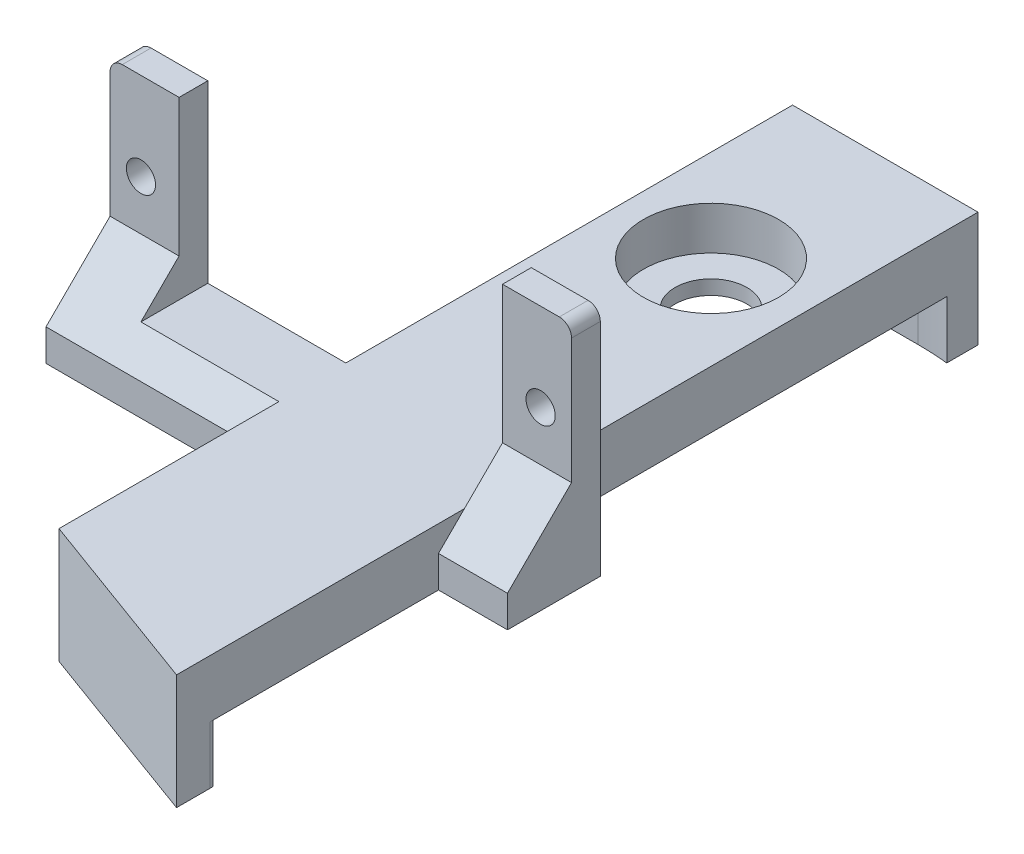
ISO-10303-21;
HEADER;
FILE_DESCRIPTION(('STEP AP214'),'2;1');
FILE_NAME('part.step','',(''),(''),'','','');
FILE_SCHEMA(('AUTOMOTIVE_DESIGN { 1 0 10303 214 1 1 1 1 }'));
ENDSEC;
DATA;
#1=APPLICATION_CONTEXT('core data for automotive mechanical design processes');
#2=APPLICATION_PROTOCOL_DEFINITION('international standard','automotive_design',2000,#1);
#3=PRODUCT_CONTEXT('',#1,'mechanical');
#4=PRODUCT('Part','Part','',(#3));
#5=PRODUCT_RELATED_PRODUCT_CATEGORY('part','',(#4));
#6=PRODUCT_DEFINITION_FORMATION('','',#4);
#7=PRODUCT_DEFINITION_CONTEXT('part definition',#1,'design');
#8=PRODUCT_DEFINITION('design','',#6,#7);
#9=PRODUCT_DEFINITION_SHAPE('','',#8);
#10=(LENGTH_UNIT() NAMED_UNIT(*) SI_UNIT(.MILLI.,.METRE.));
#11=(NAMED_UNIT(*) PLANE_ANGLE_UNIT() SI_UNIT($,.RADIAN.));
#12=(NAMED_UNIT(*) SI_UNIT($,.STERADIAN.) SOLID_ANGLE_UNIT());
#13=UNCERTAINTY_MEASURE_WITH_UNIT(LENGTH_MEASURE(1.E-05),#10,'distance_accuracy_value','');
#14=(GEOMETRIC_REPRESENTATION_CONTEXT(3) GLOBAL_UNCERTAINTY_ASSIGNED_CONTEXT((#13)) GLOBAL_UNIT_ASSIGNED_CONTEXT((#10,
#11,#12)) REPRESENTATION_CONTEXT('',''));
#15=CARTESIAN_POINT('',(0.,0.,0.));
#16=DIRECTION('',(0.,0.,1.));
#17=DIRECTION('',(1.,0.,0.));
#18=AXIS2_PLACEMENT_3D('',#15,#16,#17);
#19=CARTESIAN_POINT('',(24.0462381627888,-9.09999999999987,7.665828595555));
#20=DIRECTION('',(0.,-0.70856176119434,-0.705648801156195));
#21=DIRECTION('',(0.,0.705648801156195,-0.70856176119434));
#22=AXIS2_PLACEMENT_3D('',#19,#20,#21);
#23=PLANE('',#22);
#24=DIRECTION('',(-1.,0.,0.));
#25=VECTOR('',#24,1.);
#26=CARTESIAN_POINT('',(24.0462381627888,-7.89434521112556,6.45519679231599));
#27=LINE('',#26,#25);
#28=CARTESIAN_POINT('',(-1.64999999999999,-7.8943452111257,6.45519679231599));
#29=VERTEX_POINT('',#28);
#30=CARTESIAN_POINT('',(-16.05,-7.89434521112579,6.45519679231599));
#31=VERTEX_POINT('',#30);
#32=EDGE_CURVE('E246',#29,#31,#27,.T.);
#33=ORIENTED_EDGE('',*,*,#32,.F.);
#34=DIRECTION('',(0.,0.705648801156195,-0.70856176119434));
#35=VECTOR('',#34,1.);
#36=CARTESIAN_POINT('',(-1.65000000000002,-5.2671182257889,3.8171244584051));
#37=LINE('',#36,#35);
#38=CARTESIAN_POINT('',(-1.65000000000001,-6.10000000000001,4.65344441790159));
#39=VERTEX_POINT('',#38);
#40=EDGE_CURVE('E253',#29,#39,#37,.T.);
#41=ORIENTED_EDGE('',*,*,#40,.T.);
#42=DIRECTION('',(1.,0.,0.));
#43=VECTOR('',#42,1.);
#44=CARTESIAN_POINT('',(24.0462381627888,-6.09999999999987,4.65344441790159));
#45=LINE('',#44,#43);
#46=CARTESIAN_POINT('',(-11.25,-6.10000000000007,4.65344441790159));
#47=VERTEX_POINT('',#46);
#48=EDGE_CURVE('E432',#47,#39,#45,.T.);
#49=ORIENTED_EDGE('',*,*,#48,.F.);
#50=DIRECTION('',(0.,-0.705648801156195,0.70856176119434));
#51=VECTOR('',#50,1.);
#52=CARTESIAN_POINT('',(-11.25,-9.10000000000007,7.665828595555));
#53=LINE('',#52,#51);
#54=CARTESIAN_POINT('',(-11.25,-3.45746412666863,2.));
#55=VERTEX_POINT('',#54);
#56=EDGE_CURVE('E425',#55,#47,#53,.T.);
#57=ORIENTED_EDGE('',*,*,#56,.F.);
#58=DIRECTION('',(-1.,0.,0.));
#59=VECTOR('',#58,1.);
#60=CARTESIAN_POINT('',(24.0462381627887,-3.45746412666856,2.));
#61=LINE('',#60,#59);
#62=CARTESIAN_POINT('',(-16.05,-3.45746412666879,2.));
#63=VERTEX_POINT('',#62);
#64=EDGE_CURVE('E492',#55,#63,#61,.T.);
#65=ORIENTED_EDGE('',*,*,#64,.T.);
#66=DIRECTION('',(0.,0.705648801156195,-0.70856176119434));
#67=VECTOR('',#66,1.);
#68=CARTESIAN_POINT('',(-16.05,-9.10000000000012,7.66582859555502));
#69=LINE('',#68,#67);
#70=EDGE_CURVE('E490',#31,#63,#69,.T.);
#71=ORIENTED_EDGE('',*,*,#70,.F.);
#72=EDGE_LOOP('',(#33,#41,#49,#57,#65,#71));
#73=FACE_BOUND('',#72,.T.);
#74=ADVANCED_FACE('F34',(#73),#23,.F.);
#75=CARTESIAN_POINT('',(-16.05,0.,2.));
#76=DIRECTION('',(1.,0.,0.));
#77=DIRECTION('',(0.,1.,0.));
#78=AXIS2_PLACEMENT_3D('',#75,#76,#77);
#79=PLANE('',#78);
#80=DIRECTION('',(0.,1.,0.));
#81=VECTOR('',#80,1.);
#82=CARTESIAN_POINT('',(-16.05,-10.1000000000001,6.45519679231599));
#83=LINE('',#82,#81);
#84=CARTESIAN_POINT('',(-16.05,-10.1000000000001,6.45519679231599));
#85=VERTEX_POINT('',#84);
#86=EDGE_CURVE('E480',#85,#31,#83,.T.);
#87=ORIENTED_EDGE('',*,*,#86,.T.);
#88=ORIENTED_EDGE('',*,*,#70,.T.);
#89=DIRECTION('',(0.,-1.,0.));
#90=VECTOR('',#89,1.);
#91=CARTESIAN_POINT('',(-16.05,0.,2.));
#92=LINE('',#91,#90);
#93=CARTESIAN_POINT('',(-16.05,5.25,2.));
#94=VERTEX_POINT('',#93);
#95=EDGE_CURVE('E385',#94,#63,#92,.T.);
#96=ORIENTED_EDGE('',*,*,#95,.F.);
#97=DIRECTION('',(0.,0.,-1.));
#98=VECTOR('',#97,1.);
#99=CARTESIAN_POINT('',(-16.05,5.25,2.));
#100=LINE('',#99,#98);
#101=CARTESIAN_POINT('',(-16.05,5.25,0.));
#102=VERTEX_POINT('',#101);
#103=EDGE_CURVE('E395',#94,#102,#100,.T.);
#104=ORIENTED_EDGE('',*,*,#103,.T.);
#105=DIRECTION('',(0.,-1.,0.));
#106=VECTOR('',#105,1.);
#107=CARTESIAN_POINT('',(-16.05,0.,0.));
#108=LINE('',#107,#106);
#109=CARTESIAN_POINT('',(-16.05,-10.1000000000001,0.));
#110=VERTEX_POINT('',#109);
#111=EDGE_CURVE('E398',#102,#110,#108,.T.);
#112=ORIENTED_EDGE('',*,*,#111,.T.);
#113=DIRECTION('',(0.,0.,-1.));
#114=VECTOR('',#113,1.);
#115=CARTESIAN_POINT('',(-16.05,-10.1000000000001,6.45519679231599));
#116=LINE('',#115,#114);
#117=EDGE_CURVE('E448',#85,#110,#116,.T.);
#118=ORIENTED_EDGE('',*,*,#117,.F.);
#119=EDGE_LOOP('',(#87,#88,#96,#104,#112,#118));
#120=FACE_BOUND('',#119,.T.);
#121=ADVANCED_FACE('F579',(#120),#79,.F.);
#122=DIRECTION('',(0.,-0.705648801156195,0.70856176119434));
#123=VECTOR('',#122,1.);
#124=CARTESIAN_POINT('',(11.25,-5.26711822578882,3.8171244584051));
#125=LINE('',#124,#123);
#126=CARTESIAN_POINT('',(11.25,-6.09999999999994,4.65344441790159));
#127=VERTEX_POINT('',#126);
#128=CARTESIAN_POINT('',(11.25,-7.89434521112563,6.45519679231599));
#129=VERTEX_POINT('',#128);
#130=EDGE_CURVE('E230',#127,#129,#125,.T.);
#131=ORIENTED_EDGE('',*,*,#130,.T.);
#132=DIRECTION('',(1.,0.,0.));
#133=VECTOR('',#132,1.);
#134=CARTESIAN_POINT('',(24.0462381627888,-7.89434521112556,6.45519679231599));
#135=LINE('',#134,#133);
#136=CARTESIAN_POINT('',(16.05,-7.8943452111256,6.45519679231599));
#137=VERTEX_POINT('',#136);
#138=EDGE_CURVE('E240',#129,#137,#135,.T.);
#139=ORIENTED_EDGE('',*,*,#138,.T.);
#140=DIRECTION('',(0.,0.705648801156195,-0.70856176119434));
#141=VECTOR('',#140,1.);
#142=CARTESIAN_POINT('',(16.05,-9.09999999999991,7.665828595555));
#143=LINE('',#142,#141);
#144=CARTESIAN_POINT('',(16.05,-3.45746412666861,2.));
#145=VERTEX_POINT('',#144);
#146=EDGE_CURVE('E259',#137,#145,#143,.T.);
#147=ORIENTED_EDGE('',*,*,#146,.T.);
#148=CARTESIAN_POINT('',(11.25,-3.45746412666863,2.));
#149=VERTEX_POINT('',#148);
#150=EDGE_CURVE('E493',#145,#149,#61,.T.);
#151=ORIENTED_EDGE('',*,*,#150,.T.);
#152=DIRECTION('',(0.,0.705648801156195,-0.70856176119434));
#153=VECTOR('',#152,1.);
#154=CARTESIAN_POINT('',(11.25,-9.09999999999994,7.665828595555));
#155=LINE('',#154,#153);
#156=EDGE_CURVE('E251',#127,#149,#155,.T.);
#157=ORIENTED_EDGE('',*,*,#156,.F.);
#158=EDGE_LOOP('',(#131,#139,#147,#151,#157));
#159=FACE_BOUND('',#158,.T.);
#160=ADVANCED_FACE('F249',(#159),#23,.F.);
#161=CARTESIAN_POINT('',(0.,0.,2.));
#162=DIRECTION('',(0.,0.,1.));
#163=DIRECTION('',(1.,0.,0.));
#164=AXIS2_PLACEMENT_3D('',#161,#162,#163);
#165=PLANE('',#164);
#166=CARTESIAN_POINT('',(-13.9,0.,2.));
#167=DIRECTION('',(0.,0.,1.));
#168=DIRECTION('',(1.,0.,0.));
#169=AXIS2_PLACEMENT_3D('',#166,#167,#168);
#170=CIRCLE('',#169,1.016);
#171=CARTESIAN_POINT('',(-12.884,0.,2.));
#172=VERTEX_POINT('',#171);
#173=EDGE_CURVE('E382',#172,#172,#170,.T.);
#174=ORIENTED_EDGE('',*,*,#173,.F.);
#175=EDGE_LOOP('',(#174));
#176=FACE_BOUND('',#175,.T.);
#177=ORIENTED_EDGE('',*,*,#95,.T.);
#178=ORIENTED_EDGE('',*,*,#64,.F.);
#179=DIRECTION('',(0.,-1.,0.));
#180=VECTOR('',#179,1.);
#181=CARTESIAN_POINT('',(-11.25,0.,2.));
#182=LINE('',#181,#180);
#183=CARTESIAN_POINT('',(-11.25,6.1,2.));
#184=VERTEX_POINT('',#183);
#185=EDGE_CURVE('E389',#184,#55,#182,.T.);
#186=ORIENTED_EDGE('',*,*,#185,.F.);
#187=DIRECTION('',(-1.,0.,0.));
#188=VECTOR('',#187,1.);
#189=CARTESIAN_POINT('',(0.,6.1,2.));
#190=LINE('',#189,#188);
#191=CARTESIAN_POINT('',(-15.2,6.1,2.));
#192=VERTEX_POINT('',#191);
#193=EDGE_CURVE('E391',#184,#192,#190,.T.);
#194=ORIENTED_EDGE('',*,*,#193,.T.);
#195=CARTESIAN_POINT('',(-15.2,5.25,2.));
#196=DIRECTION('',(0.,0.,1.));
#197=DIRECTION('',(1.,0.,0.));
#198=AXIS2_PLACEMENT_3D('',#195,#196,#197);
#199=CIRCLE('',#198,0.850000000000002);
#200=EDGE_CURVE('E393',#192,#94,#199,.T.);
#201=ORIENTED_EDGE('',*,*,#200,.T.);
#202=EDGE_LOOP('',(#177,#178,#186,#194,#201));
#203=FACE_BOUND('',#202,.T.);
#204=ADVANCED_FACE('F586',(#176,#203),#165,.T.);
#205=CARTESIAN_POINT('',(0.,-9.1,2.));
#206=DIRECTION('',(0.,0.,-1.));
#207=DIRECTION('',(-1.,0.,0.));
#208=AXIS2_PLACEMENT_3D('',#205,#206,#207);
#209=PLANE('',#208);
#210=CARTESIAN_POINT('',(13.9,0.,2.));
#211=DIRECTION('',(0.,0.,1.));
#212=DIRECTION('',(1.,0.,0.));
#213=AXIS2_PLACEMENT_3D('',#210,#211,#212);
#214=CIRCLE('',#213,1.016);
#215=CARTESIAN_POINT('',(14.916,0.,2.));
#216=VERTEX_POINT('',#215);
#217=EDGE_CURVE('E310',#216,#216,#214,.T.);
#218=ORIENTED_EDGE('',*,*,#217,.F.);
#219=EDGE_LOOP('',(#218));
#220=FACE_BOUND('',#219,.T.);
#221=ORIENTED_EDGE('',*,*,#150,.F.);
#222=DIRECTION('',(0.,1.,0.));
#223=VECTOR('',#222,1.);
#224=CARTESIAN_POINT('',(16.05,-9.09999999999991,2.));
#225=LINE('',#224,#223);
#226=CARTESIAN_POINT('',(16.05,5.25,2.));
#227=VERTEX_POINT('',#226);
#228=EDGE_CURVE('E368',#145,#227,#225,.T.);
#229=ORIENTED_EDGE('',*,*,#228,.T.);
#230=CARTESIAN_POINT('',(15.2,5.25,2.));
#231=DIRECTION('',(0.,0.,1.));
#232=DIRECTION('',(1.,0.,0.));
#233=AXIS2_PLACEMENT_3D('',#230,#231,#232);
#234=CIRCLE('',#233,0.849999999999998);
#235=CARTESIAN_POINT('',(15.2,6.1,2.));
#236=VERTEX_POINT('',#235);
#237=EDGE_CURVE('E313',#227,#236,#234,.T.);
#238=ORIENTED_EDGE('',*,*,#237,.T.);
#239=DIRECTION('',(0.999998883397845,0.00149439053219066,0.));
#240=VECTOR('',#239,1.);
#241=CARTESIAN_POINT('',(-0.00908182738110785,6.07727166673534,2.));
#242=LINE('',#241,#240);
#243=CARTESIAN_POINT('',(11.25,6.09409715080671,2.));
#244=VERTEX_POINT('',#243);
#245=EDGE_CURVE('E316',#244,#236,#242,.T.);
#246=ORIENTED_EDGE('',*,*,#245,.F.);
#247=DIRECTION('',(0.,1.,0.));
#248=VECTOR('',#247,1.);
#249=CARTESIAN_POINT('',(11.25,0.,2.));
#250=LINE('',#249,#248);
#251=EDGE_CURVE('E319',#149,#244,#250,.T.);
#252=ORIENTED_EDGE('',*,*,#251,.F.);
#253=EDGE_LOOP('',(#221,#229,#238,#246,#252));
#254=FACE_BOUND('',#253,.T.);
#255=ADVANCED_FACE('F499',(#220,#254),#209,.F.);
#256=CARTESIAN_POINT('',(11.25,-9.09999999999994,0.));
#257=DIRECTION('',(-1.,0.,0.));
#258=DIRECTION('',(0.,-1.,0.));
#259=AXIS2_PLACEMENT_3D('',#256,#257,#258);
#260=PLANE('',#259);
#261=DIRECTION('',(0.,0.,1.));
#262=VECTOR('',#261,1.);
#263=CARTESIAN_POINT('',(11.25,-6.09999999999994,0.));
#264=LINE('',#263,#262);
#265=CARTESIAN_POINT('',(11.25,-6.09999999999994,24.6755929533757));
#266=VERTEX_POINT('',#265);
#267=EDGE_CURVE('E348',#127,#266,#264,.T.);
#268=ORIENTED_EDGE('',*,*,#267,.T.);
#269=DIRECTION('',(0.,1.,0.));
#270=VECTOR('',#269,1.);
#271=CARTESIAN_POINT('',(11.25,-9.09999999999994,24.6755929533757));
#272=LINE('',#271,#270);
#273=CARTESIAN_POINT('',(11.2500000000001,-14.0999999999999,24.6755929533757));
#274=VERTEX_POINT('',#273);
#275=EDGE_CURVE('E365',#274,#266,#272,.T.);
#276=ORIENTED_EDGE('',*,*,#275,.F.);
#277=DIRECTION('',(0.,0.,1.));
#278=VECTOR('',#277,1.);
#279=CARTESIAN_POINT('',(11.2500000000001,-14.0999999999999,0.));
#280=LINE('',#279,#278);
#281=CARTESIAN_POINT('',(11.2500000000001,-14.0999999999999,22.3410960151977));
#282=VERTEX_POINT('',#281);
#283=EDGE_CURVE('E293',#282,#274,#280,.T.);
#284=ORIENTED_EDGE('',*,*,#283,.F.);
#285=DIRECTION('',(0.,1.,0.));
#286=VECTOR('',#285,1.);
#287=CARTESIAN_POINT('',(11.2500000000001,-14.0999999999999,22.3410960151977));
#288=LINE('',#287,#286);
#289=CARTESIAN_POINT('',(11.25,-10.0999999999999,22.3410960151977));
#290=VERTEX_POINT('',#289);
#291=EDGE_CURVE('E302',#282,#290,#288,.T.);
#292=ORIENTED_EDGE('',*,*,#291,.T.);
#293=DIRECTION('',(0.,0.,1.));
#294=VECTOR('',#293,1.);
#295=CARTESIAN_POINT('',(11.25,-10.0999999999999,6.45519679231599));
#296=LINE('',#295,#294);
#297=CARTESIAN_POINT('',(11.25,-10.0999999999999,6.45519679231599));
#298=VERTEX_POINT('',#297);
#299=EDGE_CURVE('E233',#298,#290,#296,.T.);
#300=ORIENTED_EDGE('',*,*,#299,.F.);
#301=DIRECTION('',(0.,1.,0.));
#302=VECTOR('',#301,1.);
#303=CARTESIAN_POINT('',(11.25,-10.0999999999999,6.45519679231599));
#304=LINE('',#303,#302);
#305=EDGE_CURVE('E226',#298,#129,#304,.T.);
#306=ORIENTED_EDGE('',*,*,#305,.T.);
#307=ORIENTED_EDGE('',*,*,#130,.F.);
#308=EDGE_LOOP('',(#268,#276,#284,#292,#300,#306,#307));
#309=FACE_BOUND('',#308,.T.);
#310=ADVANCED_FACE('F228',(#309),#260,.F.);
#311=CARTESIAN_POINT('',(-1.65,-9.10000000000001,0.));
#312=DIRECTION('',(1.,0.,0.));
#313=DIRECTION('',(0.,1.,0.));
#314=AXIS2_PLACEMENT_3D('',#311,#312,#313);
#315=PLANE('',#314);
#316=ORIENTED_EDGE('',*,*,#40,.F.);
#317=DIRECTION('',(0.,1.,0.));
#318=VECTOR('',#317,1.);
#319=CARTESIAN_POINT('',(-1.65,-10.1,6.45519679231599));
#320=LINE('',#319,#318);
#321=CARTESIAN_POINT('',(-1.65,-10.1,6.45519679231599));
#322=VERTEX_POINT('',#321);
#323=EDGE_CURVE('E482',#322,#29,#320,.T.);
#324=ORIENTED_EDGE('',*,*,#323,.F.);
#325=DIRECTION('',(0.,0.,-1.));
#326=VECTOR('',#325,1.);
#327=CARTESIAN_POINT('',(-1.65,-10.1,16.386819498577));
#328=LINE('',#327,#326);
#329=CARTESIAN_POINT('',(-1.65,-10.1,16.386819498577));
#330=VERTEX_POINT('',#329);
#331=EDGE_CURVE('E561',#330,#322,#328,.T.);
#332=ORIENTED_EDGE('',*,*,#331,.F.);
#333=DIRECTION('',(0.,1.,0.));
#334=VECTOR('',#333,1.);
#335=CARTESIAN_POINT('',(-1.64999999999997,-14.1,16.386819498577));
#336=LINE('',#335,#334);
#337=CARTESIAN_POINT('',(-1.64999999999997,-14.1,16.386819498577));
#338=VERTEX_POINT('',#337);
#339=EDGE_CURVE('E49',#338,#330,#336,.T.);
#340=ORIENTED_EDGE('',*,*,#339,.F.);
#341=DIRECTION('',(0.,0.,-1.));
#342=VECTOR('',#341,1.);
#343=CARTESIAN_POINT('',(-1.64999999999997,-14.1,0.));
#344=LINE('',#343,#342);
#345=CARTESIAN_POINT('',(-1.64999999999997,-14.1,19.9527424607702));
#346=VERTEX_POINT('',#345);
#347=EDGE_CURVE('E299',#346,#338,#344,.T.);
#348=ORIENTED_EDGE('',*,*,#347,.F.);
#349=DIRECTION('',(0.,1.,0.));
#350=VECTOR('',#349,1.);
#351=CARTESIAN_POINT('',(-1.65,-9.10000000000001,19.9527424607702));
#352=LINE('',#351,#350);
#353=CARTESIAN_POINT('',(-1.65000000000002,-6.10000000000001,19.9527424607702));
#354=VERTEX_POINT('',#353);
#355=EDGE_CURVE('E363',#346,#354,#352,.T.);
#356=ORIENTED_EDGE('',*,*,#355,.T.);
#357=DIRECTION('',(0.,0.,-1.));
#358=VECTOR('',#357,1.);
#359=CARTESIAN_POINT('',(-1.65000000000002,-6.10000000000001,0.));
#360=LINE('',#359,#358);
#361=EDGE_CURVE('E353',#354,#39,#360,.T.);
#362=ORIENTED_EDGE('',*,*,#361,.T.);
#363=EDGE_LOOP('',(#316,#324,#332,#340,#348,#356,#362));
#364=FACE_BOUND('',#363,.T.);
#365=ADVANCED_FACE('F556',(#364),#315,.F.);
#366=CARTESIAN_POINT('',(0.,-6.1,0.));
#367=DIRECTION('',(0.,-1.,0.));
#368=DIRECTION('',(1.,0.,0.));
#369=AXIS2_PLACEMENT_3D('',#366,#367,#368);
#370=PLANE('',#369);
#371=DIRECTION('',(0.,0.,-1.));
#372=VECTOR('',#371,1.);
#373=CARTESIAN_POINT('',(11.25,-6.1,2.));
#374=LINE('',#373,#372);
#375=CARTESIAN_POINT('',(11.25,-6.1,0.));
#376=VERTEX_POINT('',#375);
#377=EDGE_CURVE('E321',#127,#376,#374,.T.);
#378=ORIENTED_EDGE('',*,*,#377,.T.);
#379=DIRECTION('',(0.,0.,-1.));
#380=VECTOR('',#379,1.);
#381=CARTESIAN_POINT('',(11.25,-6.09999999999994,0.));
#382=LINE('',#381,#380);
#383=CARTESIAN_POINT('',(11.25,-6.09999999999994,-31.0721362170447));
#384=VERTEX_POINT('',#383);
#385=EDGE_CURVE('E346',#376,#384,#382,.T.);
#386=ORIENTED_EDGE('',*,*,#385,.T.);
#387=DIRECTION('',(1.,0.,0.));
#388=VECTOR('',#387,1.);
#389=CARTESIAN_POINT('',(0.,-6.1,-31.0721362170447));
#390=LINE('',#389,#388);
#391=CARTESIAN_POINT('',(-1.65000000000002,-6.10000000000001,-31.0721362170447));
#392=VERTEX_POINT('',#391);
#393=EDGE_CURVE('E343',#392,#384,#390,.T.);
#394=ORIENTED_EDGE('',*,*,#393,.F.);
#395=DIRECTION('',(0.,0.,-1.));
#396=VECTOR('',#395,1.);
#397=CARTESIAN_POINT('',(-1.65000000000002,-6.10000000000001,0.));
#398=LINE('',#397,#396);
#399=CARTESIAN_POINT('',(-1.65000000000002,-6.10000000000001,0.));
#400=VERTEX_POINT('',#399);
#401=EDGE_CURVE('E341',#400,#392,#398,.T.);
#402=ORIENTED_EDGE('',*,*,#401,.F.);
#403=DIRECTION('',(-1.,0.,0.));
#404=VECTOR('',#403,1.);
#405=CARTESIAN_POINT('',(0.,-6.1,0.));
#406=LINE('',#405,#404);
#407=CARTESIAN_POINT('',(-11.25,-6.1,0.));
#408=VERTEX_POINT('',#407);
#409=EDGE_CURVE('E355',#400,#408,#406,.T.);
#410=ORIENTED_EDGE('',*,*,#409,.T.);
#411=DIRECTION('',(0.,0.,-1.));
#412=VECTOR('',#411,1.);
#413=CARTESIAN_POINT('',(-11.25,-6.1,2.));
#414=LINE('',#413,#412);
#415=EDGE_CURVE('E11',#47,#408,#414,.T.);
#416=ORIENTED_EDGE('',*,*,#415,.F.);
#417=ORIENTED_EDGE('',*,*,#48,.T.);
#418=ORIENTED_EDGE('',*,*,#361,.F.);
#419=DIRECTION('',(0.939044417262815,0.,0.343795844081251));
#420=VECTOR('',#419,1.);
#421=CARTESIAN_POINT('',(-6.63655746867287,-6.10000000000004,18.1271017322952));
#422=LINE('',#421,#420);
#423=EDGE_CURVE('E350',#354,#266,#422,.T.);
#424=ORIENTED_EDGE('',*,*,#423,.T.);
#425=ORIENTED_EDGE('',*,*,#267,.F.);
#426=EDGE_LOOP('',(#378,#386,#394,#402,#410,#416,#417,#418,#424,#425));
#427=FACE_BOUND('',#426,.T.);
#428=CARTESIAN_POINT('',(4.74999999999997,-6.09999999999998,-19.));
#429=DIRECTION('',(0.,-1.,0.));
#430=DIRECTION('',(1.,0.,0.));
#431=AXIS2_PLACEMENT_3D('',#428,#429,#430);
#432=CIRCLE('',#431,4.70000000000002);
#433=CARTESIAN_POINT('',(9.44999999999999,-6.09999999999995,-19.));
#434=VERTEX_POINT('',#433);
#435=EDGE_CURVE('E358',#434,#434,#432,.T.);
#436=ORIENTED_EDGE('',*,*,#435,.T.);
#437=EDGE_LOOP('',(#436));
#438=FACE_BOUND('',#437,.T.);
#439=ADVANCED_FACE('F429',(#427,#438),#370,.F.);
#440=CARTESIAN_POINT('',(-11.25,0.,2.));
#441=DIRECTION('',(1.,0.,0.));
#442=DIRECTION('',(0.,1.,0.));
#443=AXIS2_PLACEMENT_3D('',#440,#441,#442);
#444=PLANE('',#443);
#445=ORIENTED_EDGE('',*,*,#185,.T.);
#446=ORIENTED_EDGE('',*,*,#56,.T.);
#447=ORIENTED_EDGE('',*,*,#415,.T.);
#448=DIRECTION('',(0.,-1.,0.));
#449=VECTOR('',#448,1.);
#450=CARTESIAN_POINT('',(-11.25,0.,0.));
#451=LINE('',#450,#449);
#452=CARTESIAN_POINT('',(-11.25,6.1,0.));
#453=VERTEX_POINT('',#452);
#454=EDGE_CURVE('E400',#453,#408,#451,.T.);
#455=ORIENTED_EDGE('',*,*,#454,.F.);
#456=DIRECTION('',(0.,0.,-1.));
#457=VECTOR('',#456,1.);
#458=CARTESIAN_POINT('',(-11.25,6.1,2.));
#459=LINE('',#458,#457);
#460=EDGE_CURVE('E42',#184,#453,#459,.T.);
#461=ORIENTED_EDGE('',*,*,#460,.F.);
#462=EDGE_LOOP('',(#445,#446,#447,#455,#461));
#463=FACE_BOUND('',#462,.T.);
#464=ADVANCED_FACE('F422',(#463),#444,.T.);
#465=CARTESIAN_POINT('',(0.,6.1,2.));
#466=DIRECTION('',(0.,-1.,0.));
#467=DIRECTION('',(0.,0.,-1.));
#468=AXIS2_PLACEMENT_3D('',#465,#466,#467);
#469=PLANE('',#468);
#470=DIRECTION('',(-1.,0.,0.));
#471=VECTOR('',#470,1.);
#472=CARTESIAN_POINT('',(0.,6.1,0.));
#473=LINE('',#472,#471);
#474=CARTESIAN_POINT('',(-15.2,6.1,0.));
#475=VERTEX_POINT('',#474);
#476=EDGE_CURVE('E402',#453,#475,#473,.T.);
#477=ORIENTED_EDGE('',*,*,#476,.T.);
#478=DIRECTION('',(0.,0.,-1.));
#479=VECTOR('',#478,1.);
#480=CARTESIAN_POINT('',(-15.2,6.1,2.));
#481=LINE('',#480,#479);
#482=EDGE_CURVE('E407',#192,#475,#481,.T.);
#483=ORIENTED_EDGE('',*,*,#482,.F.);
#484=ORIENTED_EDGE('',*,*,#193,.F.);
#485=ORIENTED_EDGE('',*,*,#460,.T.);
#486=EDGE_LOOP('',(#477,#483,#484,#485));
#487=FACE_BOUND('',#486,.T.);
#488=ADVANCED_FACE('F412',(#487),#469,.F.);
#489=CARTESIAN_POINT('',(-13.9,0.,2.));
#490=DIRECTION('',(0.,0.,-1.));
#491=DIRECTION('',(-1.,0.,0.));
#492=AXIS2_PLACEMENT_3D('',#489,#490,#491);
#493=CYLINDRICAL_SURFACE('',#492,1.016);
#494=ORIENTED_EDGE('',*,*,#173,.T.);
#495=EDGE_LOOP('',(#494));
#496=FACE_BOUND('',#495,.T.);
#497=CARTESIAN_POINT('',(-13.9,0.,0.));
#498=DIRECTION('',(0.,0.,1.));
#499=DIRECTION('',(1.,0.,0.));
#500=AXIS2_PLACEMENT_3D('',#497,#498,#499);
#501=CIRCLE('',#500,1.016);
#502=CARTESIAN_POINT('',(-12.884,0.,0.));
#503=VERTEX_POINT('',#502);
#504=EDGE_CURVE('E381',#503,#503,#501,.T.);
#505=ORIENTED_EDGE('',*,*,#504,.F.);
#506=EDGE_LOOP('',(#505));
#507=FACE_BOUND('',#506,.T.);
#508=ADVANCED_FACE('F36',(#496,#507),#493,.F.);
#509=CARTESIAN_POINT('',(-15.2,5.25,2.));
#510=DIRECTION('',(0.,0.,-1.));
#511=DIRECTION('',(-1.,0.,0.));
#512=AXIS2_PLACEMENT_3D('',#509,#510,#511);
#513=CYLINDRICAL_SURFACE('',#512,0.850000000000002);
#514=CARTESIAN_POINT('',(-15.2,5.25,0.));
#515=DIRECTION('',(0.,0.,1.));
#516=DIRECTION('',(1.,0.,0.));
#517=AXIS2_PLACEMENT_3D('',#514,#515,#516);
#518=CIRCLE('',#517,0.850000000000002);
#519=EDGE_CURVE('E386',#475,#102,#518,.T.);
#520=ORIENTED_EDGE('',*,*,#519,.T.);
#521=ORIENTED_EDGE('',*,*,#103,.F.);
#522=ORIENTED_EDGE('',*,*,#200,.F.);
#523=ORIENTED_EDGE('',*,*,#482,.T.);
#524=EDGE_LOOP('',(#520,#521,#522,#523));
#525=FACE_BOUND('',#524,.T.);
#526=ADVANCED_FACE('F584',(#525),#513,.T.);
#527=CARTESIAN_POINT('',(0.,0.,0.));
#528=DIRECTION('',(0.,0.,1.));
#529=DIRECTION('',(1.,0.,0.));
#530=AXIS2_PLACEMENT_3D('',#527,#528,#529);
#531=PLANE('',#530);
#532=ORIENTED_EDGE('',*,*,#504,.T.);
#533=EDGE_LOOP('',(#532));
#534=FACE_BOUND('',#533,.T.);
#535=ORIENTED_EDGE('',*,*,#111,.F.);
#536=ORIENTED_EDGE('',*,*,#519,.F.);
#537=ORIENTED_EDGE('',*,*,#476,.F.);
#538=ORIENTED_EDGE('',*,*,#454,.T.);
#539=ORIENTED_EDGE('',*,*,#409,.F.);
#540=DIRECTION('',(0.,1.,0.));
#541=VECTOR('',#540,1.);
#542=CARTESIAN_POINT('',(-1.65,-9.10000000000001,0.));
#543=LINE('',#542,#541);
#544=CARTESIAN_POINT('',(-1.65,-10.1,0.));
#545=VERTEX_POINT('',#544);
#546=EDGE_CURVE('E361',#545,#400,#543,.T.);
#547=ORIENTED_EDGE('',*,*,#546,.F.);
#548=DIRECTION('',(1.,0.,0.));
#549=VECTOR('',#548,1.);
#550=CARTESIAN_POINT('',(-16.05,-10.1000000000001,0.));
#551=LINE('',#550,#549);
#552=EDGE_CURVE('E437',#110,#545,#551,.T.);
#553=ORIENTED_EDGE('',*,*,#552,.F.);
#554=EDGE_LOOP('',(#535,#536,#537,#538,#539,#547,#553));
#555=FACE_BOUND('',#554,.T.);
#556=ADVANCED_FACE('F420',(#534,#555),#531,.F.);
#557=CARTESIAN_POINT('',(-1.65,-9.10000000000001,0.));
#558=DIRECTION('',(1.,0.,0.));
#559=DIRECTION('',(0.,1.,0.));
#560=AXIS2_PLACEMENT_3D('',#557,#558,#559);
#561=PLANE('',#560);
#562=ORIENTED_EDGE('',*,*,#401,.T.);
#563=DIRECTION('',(0.,1.,0.));
#564=VECTOR('',#563,1.);
#565=CARTESIAN_POINT('',(-1.65,-9.10000000000001,-31.0721362170447));
#566=LINE('',#565,#564);
#567=CARTESIAN_POINT('',(-1.64999999999997,-14.1,-31.0721362170447));
#568=VERTEX_POINT('',#567);
#569=EDGE_CURVE('E378',#568,#392,#566,.T.);
#570=ORIENTED_EDGE('',*,*,#569,.F.);
#571=DIRECTION('',(0.,0.,-1.));
#572=VECTOR('',#571,1.);
#573=CARTESIAN_POINT('',(-1.64999999999997,-14.1,0.));
#574=LINE('',#573,#572);
#575=CARTESIAN_POINT('',(-1.64999999999997,-14.1,-26.696759058201));
#576=VERTEX_POINT('',#575);
#577=EDGE_CURVE('E256',#576,#568,#574,.T.);
#578=ORIENTED_EDGE('',*,*,#577,.F.);
#579=DIRECTION('',(0.,1.,0.));
#580=VECTOR('',#579,1.);
#581=CARTESIAN_POINT('',(-1.64999999999997,-14.1,-26.696759058201));
#582=LINE('',#581,#580);
#583=CARTESIAN_POINT('',(-1.65,-10.1,-26.696759058201));
#584=VERTEX_POINT('',#583);
#585=EDGE_CURVE('E284',#576,#584,#582,.T.);
#586=ORIENTED_EDGE('',*,*,#585,.T.);
#587=DIRECTION('',(0.,0.,-1.));
#588=VECTOR('',#587,1.);
#589=CARTESIAN_POINT('',(-1.65,-10.1,0.));
#590=LINE('',#589,#588);
#591=EDGE_CURVE('E446',#545,#584,#590,.T.);
#592=ORIENTED_EDGE('',*,*,#591,.F.);
#593=ORIENTED_EDGE('',*,*,#546,.T.);
#594=EDGE_LOOP('',(#562,#570,#578,#586,#592,#593));
#595=FACE_BOUND('',#594,.T.);
#596=ADVANCED_FACE('F450',(#595),#561,.F.);
#597=CARTESIAN_POINT('',(0.,-9.1,-31.0721362170447));
#598=DIRECTION('',(0.,0.,1.));
#599=DIRECTION('',(1.,0.,0.));
#600=AXIS2_PLACEMENT_3D('',#597,#598,#599);
#601=PLANE('',#600);
#602=ORIENTED_EDGE('',*,*,#393,.T.);
#603=DIRECTION('',(0.,1.,0.));
#604=VECTOR('',#603,1.);
#605=CARTESIAN_POINT('',(11.25,-9.09999999999994,-31.0721362170447));
#606=LINE('',#605,#604);
#607=CARTESIAN_POINT('',(11.2500000000001,-14.0999999999999,-31.0721362170447));
#608=VERTEX_POINT('',#607);
#609=EDGE_CURVE('E375',#608,#384,#606,.T.);
#610=ORIENTED_EDGE('',*,*,#609,.F.);
#611=DIRECTION('',(1.,0.,0.));
#612=VECTOR('',#611,1.);
#613=CARTESIAN_POINT('',(0.,-14.1,-31.0721362170447));
#614=LINE('',#613,#612);
#615=EDGE_CURVE('E265',#568,#608,#614,.T.);
#616=ORIENTED_EDGE('',*,*,#615,.F.);
#617=ORIENTED_EDGE('',*,*,#569,.T.);
#618=EDGE_LOOP('',(#602,#610,#616,#617));
#619=FACE_BOUND('',#618,.T.);
#620=ADVANCED_FACE('F526',(#619),#601,.F.);
#621=CARTESIAN_POINT('',(11.25,-9.09999999999994,0.));
#622=DIRECTION('',(1.,0.,0.));
#623=DIRECTION('',(0.,1.,0.));
#624=AXIS2_PLACEMENT_3D('',#621,#622,#623);
#625=PLANE('',#624);
#626=DIRECTION('',(0.,1.,0.));
#627=VECTOR('',#626,1.);
#628=CARTESIAN_POINT('',(11.25,-9.09999999999994,0.));
#629=LINE('',#628,#627);
#630=CARTESIAN_POINT('',(11.25,-10.0999999999999,0.));
#631=VERTEX_POINT('',#630);
#632=EDGE_CURVE('E372',#631,#376,#629,.T.);
#633=ORIENTED_EDGE('',*,*,#632,.F.);
#634=DIRECTION('',(0.,0.,1.));
#635=VECTOR('',#634,1.);
#636=CARTESIAN_POINT('',(11.25,-10.0999999999999,-28.8994974844237));
#637=LINE('',#636,#635);
#638=CARTESIAN_POINT('',(11.25,-10.0999999999999,-28.8994974844237));
#639=VERTEX_POINT('',#638);
#640=EDGE_CURVE('E463',#639,#631,#637,.T.);
#641=ORIENTED_EDGE('',*,*,#640,.F.);
#642=DIRECTION('',(0.,1.,0.));
#643=VECTOR('',#642,1.);
#644=CARTESIAN_POINT('',(11.2500000000001,-14.0999999999999,-28.8994974844237));
#645=LINE('',#644,#643);
#646=CARTESIAN_POINT('',(11.2500000000001,-14.0999999999999,-28.8994974844237));
#647=VERTEX_POINT('',#646);
#648=EDGE_CURVE('E282',#647,#639,#645,.T.);
#649=ORIENTED_EDGE('',*,*,#648,.F.);
#650=DIRECTION('',(0.,0.,-1.));
#651=VECTOR('',#650,1.);
#652=CARTESIAN_POINT('',(11.2500000000001,-14.0999999999999,0.));
#653=LINE('',#652,#651);
#654=EDGE_CURVE('E268',#647,#608,#653,.T.);
#655=ORIENTED_EDGE('',*,*,#654,.T.);
#656=ORIENTED_EDGE('',*,*,#609,.T.);
#657=ORIENTED_EDGE('',*,*,#385,.F.);
#658=EDGE_LOOP('',(#633,#641,#649,#655,#656,#657));
#659=FACE_BOUND('',#658,.T.);
#660=ADVANCED_FACE('F522',(#659),#625,.T.);
#661=CARTESIAN_POINT('',(0.,-9.1,0.));
#662=DIRECTION('',(0.,0.,1.));
#663=DIRECTION('',(1.,0.,0.));
#664=AXIS2_PLACEMENT_3D('',#661,#662,#663);
#665=PLANE('',#664);
#666=ORIENTED_EDGE('',*,*,#632,.T.);
#667=DIRECTION('',(0.,1.,0.));
#668=VECTOR('',#667,1.);
#669=CARTESIAN_POINT('',(11.25,0.,0.));
#670=LINE('',#669,#668);
#671=CARTESIAN_POINT('',(11.25,6.09409715080671,0.));
#672=VERTEX_POINT('',#671);
#673=EDGE_CURVE('E314',#376,#672,#670,.T.);
#674=ORIENTED_EDGE('',*,*,#673,.T.);
#675=DIRECTION('',(0.999998883397845,0.00149439053219066,0.));
#676=VECTOR('',#675,1.);
#677=CARTESIAN_POINT('',(-0.00908182738110785,6.07727166673534,0.));
#678=LINE('',#677,#676);
#679=CARTESIAN_POINT('',(15.2,6.1,0.));
#680=VERTEX_POINT('',#679);
#681=EDGE_CURVE('E327',#672,#680,#678,.T.);
#682=ORIENTED_EDGE('',*,*,#681,.T.);
#683=CARTESIAN_POINT('',(15.2,5.25,0.));
#684=DIRECTION('',(0.,0.,1.));
#685=DIRECTION('',(1.,0.,0.));
#686=AXIS2_PLACEMENT_3D('',#683,#684,#685);
#687=CIRCLE('',#686,0.849999999999998);
#688=CARTESIAN_POINT('',(16.05,5.25,0.));
#689=VERTEX_POINT('',#688);
#690=EDGE_CURVE('E324',#689,#680,#687,.T.);
#691=ORIENTED_EDGE('',*,*,#690,.F.);
#692=DIRECTION('',(0.,1.,0.));
#693=VECTOR('',#692,1.);
#694=CARTESIAN_POINT('',(16.05,-9.09999999999991,0.));
#695=LINE('',#694,#693);
#696=CARTESIAN_POINT('',(16.05,-10.0999999999999,0.));
#697=VERTEX_POINT('',#696);
#698=EDGE_CURVE('E370',#697,#689,#695,.T.);
#699=ORIENTED_EDGE('',*,*,#698,.F.);
#700=DIRECTION('',(1.,0.,0.));
#701=VECTOR('',#700,1.);
#702=CARTESIAN_POINT('',(11.25,-10.0999999999999,0.));
#703=LINE('',#702,#701);
#704=EDGE_CURVE('E466',#631,#697,#703,.T.);
#705=ORIENTED_EDGE('',*,*,#704,.F.);
#706=EDGE_LOOP('',(#666,#674,#682,#691,#699,#705));
#707=FACE_BOUND('',#706,.T.);
#708=CARTESIAN_POINT('',(13.9,0.,0.));
#709=DIRECTION('',(0.,0.,1.));
#710=DIRECTION('',(1.,0.,0.));
#711=AXIS2_PLACEMENT_3D('',#708,#709,#710);
#712=CIRCLE('',#711,1.016);
#713=CARTESIAN_POINT('',(14.916,0.,0.));
#714=VERTEX_POINT('',#713);
#715=EDGE_CURVE('E309',#714,#714,#712,.T.);
#716=ORIENTED_EDGE('',*,*,#715,.T.);
#717=EDGE_LOOP('',(#716));
#718=FACE_BOUND('',#717,.T.);
#719=ADVANCED_FACE('F518',(#707,#718),#665,.F.);
#720=CARTESIAN_POINT('',(16.05,-9.09999999999991,0.));
#721=DIRECTION('',(-1.,0.,0.));
#722=DIRECTION('',(0.,-1.,0.));
#723=AXIS2_PLACEMENT_3D('',#720,#721,#722);
#724=PLANE('',#723);
#725=ORIENTED_EDGE('',*,*,#146,.F.);
#726=DIRECTION('',(0.,1.,0.));
#727=VECTOR('',#726,1.);
#728=CARTESIAN_POINT('',(16.05,-10.0999999999999,6.45519679231599));
#729=LINE('',#728,#727);
#730=CARTESIAN_POINT('',(16.05,-10.0999999999999,6.45519679231599));
#731=VERTEX_POINT('',#730);
#732=EDGE_CURVE('E236',#731,#137,#729,.T.);
#733=ORIENTED_EDGE('',*,*,#732,.F.);
#734=DIRECTION('',(0.,0.,1.));
#735=VECTOR('',#734,1.);
#736=CARTESIAN_POINT('',(16.05,-10.0999999999999,0.));
#737=LINE('',#736,#735);
#738=EDGE_CURVE('E469',#697,#731,#737,.T.);
#739=ORIENTED_EDGE('',*,*,#738,.F.);
#740=ORIENTED_EDGE('',*,*,#698,.T.);
#741=DIRECTION('',(0.,0.,-1.));
#742=VECTOR('',#741,1.);
#743=CARTESIAN_POINT('',(16.05,5.25,2.));
#744=LINE('',#743,#742);
#745=EDGE_CURVE('E338',#227,#689,#744,.T.);
#746=ORIENTED_EDGE('',*,*,#745,.F.);
#747=ORIENTED_EDGE('',*,*,#228,.F.);
#748=EDGE_LOOP('',(#725,#733,#739,#740,#746,#747));
#749=FACE_BOUND('',#748,.T.);
#750=ADVANCED_FACE('F502',(#749),#724,.F.);
#751=CARTESIAN_POINT('',(-6.63655746867285,-9.10000000000004,18.1271017322952));
#752=DIRECTION('',(-0.343795844081251,0.,0.939044417262815));
#753=DIRECTION('',(0.939044417262815,0.,0.343795844081251));
#754=AXIS2_PLACEMENT_3D('',#751,#752,#753);
#755=PLANE('',#754);
#756=ORIENTED_EDGE('',*,*,#423,.F.);
#757=ORIENTED_EDGE('',*,*,#355,.F.);
#758=DIRECTION('',(0.939044417262815,0.,0.343795844081251));
#759=VECTOR('',#758,1.);
#760=CARTESIAN_POINT('',(-6.63655746867283,-14.1,18.1271017322952));
#761=LINE('',#760,#759);
#762=EDGE_CURVE('E296',#346,#274,#761,.T.);
#763=ORIENTED_EDGE('',*,*,#762,.T.);
#764=ORIENTED_EDGE('',*,*,#275,.T.);
#765=EDGE_LOOP('',(#756,#757,#763,#764));
#766=FACE_BOUND('',#765,.T.);
#767=ADVANCED_FACE('F552',(#766),#755,.T.);
#768=CARTESIAN_POINT('',(4.74999999999998,-9.09999999999998,-19.));
#769=DIRECTION('',(0.,1.,0.));
#770=DIRECTION('',(-1.,0.,0.));
#771=AXIS2_PLACEMENT_3D('',#768,#769,#770);
#772=CYLINDRICAL_SURFACE('',#771,4.70000000000002);
#773=CARTESIAN_POINT('',(4.74999999999998,-9.09999999999998,-19.));
#774=DIRECTION('',(0.,-1.,0.));
#775=DIRECTION('',(1.,0.,0.));
#776=AXIS2_PLACEMENT_3D('',#773,#774,#775);
#777=CIRCLE('',#776,4.70000000000002);
#778=CARTESIAN_POINT('',(9.45,-9.09999999999995,-19.));
#779=VERTEX_POINT('',#778);
#780=EDGE_CURVE('E484',#779,#779,#777,.T.);
#781=ORIENTED_EDGE('',*,*,#780,.T.);
#782=EDGE_LOOP('',(#781));
#783=FACE_BOUND('',#782,.T.);
#784=ORIENTED_EDGE('',*,*,#435,.F.);
#785=EDGE_LOOP('',(#784));
#786=FACE_BOUND('',#785,.T.);
#787=ADVANCED_FACE('F633',(#783,#786),#772,.F.);
#788=CARTESIAN_POINT('',(15.2,5.25,2.));
#789=DIRECTION('',(0.,0.,-1.));
#790=DIRECTION('',(-1.,0.,0.));
#791=AXIS2_PLACEMENT_3D('',#788,#789,#790);
#792=CYLINDRICAL_SURFACE('',#791,0.849999999999998);
#793=ORIENTED_EDGE('',*,*,#690,.T.);
#794=DIRECTION('',(0.,0.,-1.));
#795=VECTOR('',#794,1.);
#796=CARTESIAN_POINT('',(15.2,6.1,2.));
#797=LINE('',#796,#795);
#798=EDGE_CURVE('E336',#236,#680,#797,.T.);
#799=ORIENTED_EDGE('',*,*,#798,.F.);
#800=ORIENTED_EDGE('',*,*,#237,.F.);
#801=ORIENTED_EDGE('',*,*,#745,.T.);
#802=EDGE_LOOP('',(#793,#799,#800,#801));
#803=FACE_BOUND('',#802,.T.);
#804=ADVANCED_FACE('F508',(#803),#792,.T.);
#805=CARTESIAN_POINT('',(-0.00908182738110785,6.07727166673534,2.));
#806=DIRECTION('',(-0.00149439053219066,0.999998883397845,0.));
#807=DIRECTION('',(-0.999998883397845,-0.00149439053219066,0.));
#808=AXIS2_PLACEMENT_3D('',#805,#806,#807);
#809=PLANE('',#808);
#810=ORIENTED_EDGE('',*,*,#681,.F.);
#811=DIRECTION('',(0.,0.,-1.));
#812=VECTOR('',#811,1.);
#813=CARTESIAN_POINT('',(11.25,6.09409715080671,2.));
#814=LINE('',#813,#812);
#815=EDGE_CURVE('E333',#244,#672,#814,.T.);
#816=ORIENTED_EDGE('',*,*,#815,.F.);
#817=ORIENTED_EDGE('',*,*,#245,.T.);
#818=ORIENTED_EDGE('',*,*,#798,.T.);
#819=EDGE_LOOP('',(#810,#816,#817,#818));
#820=FACE_BOUND('',#819,.T.);
#821=ADVANCED_FACE('F512',(#820),#809,.T.);
#822=CARTESIAN_POINT('',(11.25,0.,2.));
#823=DIRECTION('',(-1.,0.,0.));
#824=DIRECTION('',(0.,-1.,0.));
#825=AXIS2_PLACEMENT_3D('',#822,#823,#824);
#826=PLANE('',#825);
#827=ORIENTED_EDGE('',*,*,#815,.T.);
#828=ORIENTED_EDGE('',*,*,#673,.F.);
#829=ORIENTED_EDGE('',*,*,#377,.F.);
#830=ORIENTED_EDGE('',*,*,#156,.T.);
#831=ORIENTED_EDGE('',*,*,#251,.T.);
#832=EDGE_LOOP('',(#827,#828,#829,#830,#831));
#833=FACE_BOUND('',#832,.T.);
#834=ADVANCED_FACE('F514',(#833),#826,.T.);
#835=CARTESIAN_POINT('',(13.9,0.,2.));
#836=DIRECTION('',(0.,0.,-1.));
#837=DIRECTION('',(-1.,0.,0.));
#838=AXIS2_PLACEMENT_3D('',#835,#836,#837);
#839=CYLINDRICAL_SURFACE('',#838,1.016);
#840=ORIENTED_EDGE('',*,*,#217,.T.);
#841=EDGE_LOOP('',(#840));
#842=FACE_BOUND('',#841,.T.);
#843=ORIENTED_EDGE('',*,*,#715,.F.);
#844=EDGE_LOOP('',(#843));
#845=FACE_BOUND('',#844,.T.);
#846=ADVANCED_FACE('F631',(#842,#845),#839,.F.);
#847=CARTESIAN_POINT('',(4.75000000000001,-14.1,8.69006044037595));
#848=DIRECTION('',(0.,1.,0.));
#849=DIRECTION('',(-1.,0.,0.));
#850=AXIS2_PLACEMENT_3D('',#847,#848,#849);
#851=CYLINDRICAL_SURFACE('',#850,10.01);
#852=CARTESIAN_POINT('',(4.74999999999999,-10.1,8.69006044037595));
#853=DIRECTION('',(0.,-1.,0.));
#854=DIRECTION('',(1.,0.,0.));
#855=AXIS2_PLACEMENT_3D('',#852,#853,#854);
#856=CIRCLE('',#855,10.01);
#857=CARTESIAN_POINT('',(0.991848608036988,-10.1,17.9677971317833));
#858=VERTEX_POINT('',#857);
#859=EDGE_CURVE('E54',#858,#330,#856,.T.);
#860=ORIENTED_EDGE('',*,*,#859,.F.);
#861=DIRECTION('',(0.,1.,0.));
#862=VECTOR('',#861,1.);
#863=CARTESIAN_POINT('',(0.991848608037011,-14.1,17.9677971317833));
#864=LINE('',#863,#862);
#865=CARTESIAN_POINT('',(0.991848608037011,-14.1,17.9677971317833));
#866=VERTEX_POINT('',#865);
#867=EDGE_CURVE('E307',#866,#858,#864,.T.);
#868=ORIENTED_EDGE('',*,*,#867,.F.);
#869=CARTESIAN_POINT('',(4.75000000000001,-14.1,8.69006044037595));
#870=DIRECTION('',(0.,-1.,0.));
#871=DIRECTION('',(1.,0.,0.));
#872=AXIS2_PLACEMENT_3D('',#869,#870,#871);
#873=CIRCLE('',#872,10.01);
#874=EDGE_CURVE('E287',#866,#338,#873,.T.);
#875=ORIENTED_EDGE('',*,*,#874,.T.);
#876=ORIENTED_EDGE('',*,*,#339,.T.);
#877=EDGE_LOOP('',(#860,#868,#875,#876));
#878=FACE_BOUND('',#877,.T.);
#879=ADVANCED_FACE('F558',(#878),#851,.F.);
#880=CARTESIAN_POINT('',(-6.11253987930408,-14.1,15.0900082517136));
#881=DIRECTION('',(-0.375439699496806,0.,0.926846822318418));
#882=DIRECTION('',(0.926846822318418,0.,0.375439699496806));
#883=AXIS2_PLACEMENT_3D('',#880,#881,#882);
#884=PLANE('',#883);
#885=ORIENTED_EDGE('',*,*,#867,.T.);
#886=DIRECTION('',(-0.926846822318418,0.,-0.375439699496806));
#887=VECTOR('',#886,1.);
#888=CARTESIAN_POINT('',(11.2462456030051,-10.0999999999999,22.1215662699043));
#889=LINE('',#888,#887);
#890=CARTESIAN_POINT('',(11.2462456030051,-10.1,22.1215662699043));
#891=VERTEX_POINT('',#890);
#892=EDGE_CURVE('E237',#891,#858,#889,.T.);
#893=ORIENTED_EDGE('',*,*,#892,.F.);
#894=DIRECTION('',(0.,1.,0.));
#895=VECTOR('',#894,1.);
#896=CARTESIAN_POINT('',(11.2462456030051,-14.0999999999999,22.1215662699043));
#897=LINE('',#896,#895);
#898=CARTESIAN_POINT('',(11.2462456030051,-14.0999999999999,22.1215662699043));
#899=VERTEX_POINT('',#898);
#900=EDGE_CURVE('E304',#899,#891,#897,.T.);
#901=ORIENTED_EDGE('',*,*,#900,.F.);
#902=DIRECTION('',(0.926846822318418,0.,0.375439699496806));
#903=VECTOR('',#902,1.);
#904=CARTESIAN_POINT('',(-6.11253987930408,-14.1,15.0900082517136));
#905=LINE('',#904,#903);
#906=EDGE_CURVE('E289',#866,#899,#905,.T.);
#907=ORIENTED_EDGE('',*,*,#906,.F.);
#908=EDGE_LOOP('',(#885,#893,#901,#907));
#909=FACE_BOUND('',#908,.T.);
#910=ADVANCED_FACE('F560',(#909),#884,.F.);
#911=CARTESIAN_POINT('',(10.8647449460437,-14.0999999999999,-0.185808832976415));
#912=DIRECTION('',(-0.999853792924251,0.,0.0170994963372747));
#913=DIRECTION('',(0.0170994963372747,0.,0.999853792924251));
#914=AXIS2_PLACEMENT_3D('',#911,#912,#913);
#915=PLANE('',#914);
#916=ORIENTED_EDGE('',*,*,#900,.T.);
#917=DIRECTION('',(-0.0170994963372753,0.,-0.999853792924251));
#918=VECTOR('',#917,1.);
#919=CARTESIAN_POINT('',(11.25,-10.0999999999999,22.3410960151975));
#920=LINE('',#919,#918);
#921=EDGE_CURVE('E474',#290,#891,#920,.T.);
#922=ORIENTED_EDGE('',*,*,#921,.F.);
#923=ORIENTED_EDGE('',*,*,#291,.F.);
#924=DIRECTION('',(0.0170994963372747,0.,0.999853792924251));
#925=VECTOR('',#924,1.);
#926=CARTESIAN_POINT('',(10.8647449460437,-14.0999999999999,-0.185808832976415));
#927=LINE('',#926,#925);
#928=EDGE_CURVE('E291',#899,#282,#927,.T.);
#929=ORIENTED_EDGE('',*,*,#928,.F.);
#930=EDGE_LOOP('',(#916,#922,#923,#929));
#931=FACE_BOUND('',#930,.T.);
#932=ADVANCED_FACE('F542',(#931),#915,.F.);
#933=CARTESIAN_POINT('',(0.,-14.1,0.));
#934=DIRECTION('',(0.,-1.,0.));
#935=DIRECTION('',(1.,0.,0.));
#936=AXIS2_PLACEMENT_3D('',#933,#934,#935);
#937=PLANE('',#936);
#938=ORIENTED_EDGE('',*,*,#874,.F.);
#939=ORIENTED_EDGE('',*,*,#906,.T.);
#940=ORIENTED_EDGE('',*,*,#928,.T.);
#941=ORIENTED_EDGE('',*,*,#283,.T.);
#942=ORIENTED_EDGE('',*,*,#762,.F.);
#943=ORIENTED_EDGE('',*,*,#347,.T.);
#944=EDGE_LOOP('',(#938,#939,#940,#941,#942,#943));
#945=FACE_BOUND('',#944,.T.);
#946=ADVANCED_FACE('F549',(#945),#937,.T.);
#947=CARTESIAN_POINT('',(4.75000000000003,-14.1,-19.));
#948=DIRECTION('',(0.,1.,0.));
#949=DIRECTION('',(-1.,0.,0.));
#950=AXIS2_PLACEMENT_3D('',#947,#948,#949);
#951=CYLINDRICAL_SURFACE('',#950,10.01);
#952=CARTESIAN_POINT('',(4.75000000000001,-10.1,-19.));
#953=DIRECTION('',(0.,-1.,0.));
#954=DIRECTION('',(1.,0.,0.));
#955=AXIS2_PLACEMENT_3D('',#952,#953,#954);
#956=CIRCLE('',#955,10.01);
#957=CARTESIAN_POINT('',(4.74999999999999,-10.1,-29.01));
#958=VERTEX_POINT('',#957);
#959=EDGE_CURVE('E452',#584,#958,#956,.T.);
#960=ORIENTED_EDGE('',*,*,#959,.F.);
#961=ORIENTED_EDGE('',*,*,#585,.F.);
#962=CARTESIAN_POINT('',(4.75000000000003,-14.1,-19.));
#963=DIRECTION('',(0.,-1.,0.));
#964=DIRECTION('',(1.,0.,0.));
#965=AXIS2_PLACEMENT_3D('',#962,#963,#964);
#966=CIRCLE('',#965,10.01);
#967=CARTESIAN_POINT('',(4.75000000000001,-14.1,-29.01));
#968=VERTEX_POINT('',#967);
#969=EDGE_CURVE('E252',#576,#968,#966,.T.);
#970=ORIENTED_EDGE('',*,*,#969,.T.);
#971=DIRECTION('',(0.,1.,0.));
#972=VECTOR('',#971,1.);
#973=CARTESIAN_POINT('',(4.75000000000001,-14.1,-29.01));
#974=LINE('',#973,#972);
#975=EDGE_CURVE('E276',#968,#958,#974,.T.);
#976=ORIENTED_EDGE('',*,*,#975,.T.);
#977=EDGE_LOOP('',(#960,#961,#970,#976));
#978=FACE_BOUND('',#977,.T.);
#979=ADVANCED_FACE('F534',(#978),#951,.F.);
#980=CARTESIAN_POINT('',(9.14997622217938,-14.1,-8.99999999999998));
#981=DIRECTION('',(0.,1.,0.));
#982=DIRECTION('',(-1.,0.,0.));
#983=AXIS2_PLACEMENT_3D('',#980,#981,#982);
#984=CYLINDRICAL_SURFACE('',#983,20.01);
#985=CARTESIAN_POINT('',(9.14997622217936,-10.1,-8.99999999999998));
#986=DIRECTION('',(0.,-1.,0.));
#987=DIRECTION('',(1.,0.,0.));
#988=AXIS2_PLACEMENT_3D('',#985,#986,#987);
#989=CIRCLE('',#988,20.01);
#990=CARTESIAN_POINT('',(9.14997622217936,-10.0999999999999,-29.01));
#991=VERTEX_POINT('',#990);
#992=EDGE_CURVE('E460',#991,#639,#989,.T.);
#993=ORIENTED_EDGE('',*,*,#992,.F.);
#994=DIRECTION('',(0.,1.,0.));
#995=VECTOR('',#994,1.);
#996=CARTESIAN_POINT('',(9.14997622217938,-14.1,-29.01));
#997=LINE('',#996,#995);
#998=CARTESIAN_POINT('',(9.14997622217938,-14.1,-29.01));
#999=VERTEX_POINT('',#998);
#1000=EDGE_CURVE('E279',#999,#991,#997,.T.);
#1001=ORIENTED_EDGE('',*,*,#1000,.F.);
#1002=CARTESIAN_POINT('',(9.14997622217938,-14.1,-8.99999999999998));
#1003=DIRECTION('',(0.,-1.,0.));
#1004=DIRECTION('',(1.,0.,0.));
#1005=AXIS2_PLACEMENT_3D('',#1002,#1003,#1004);
#1006=CIRCLE('',#1005,20.01);
#1007=EDGE_CURVE('E271',#999,#647,#1006,.T.);
#1008=ORIENTED_EDGE('',*,*,#1007,.T.);
#1009=ORIENTED_EDGE('',*,*,#648,.T.);
#1010=EDGE_LOOP('',(#993,#1001,#1008,#1009));
#1011=FACE_BOUND('',#1010,.T.);
#1012=ADVANCED_FACE('F538',(#1011),#984,.F.);
#1013=CARTESIAN_POINT('',(0.,-14.1,-29.01));
#1014=DIRECTION('',(0.,0.,-1.));
#1015=DIRECTION('',(-1.,0.,0.));
#1016=AXIS2_PLACEMENT_3D('',#1013,#1014,#1015);
#1017=PLANE('',#1016);
#1018=ORIENTED_EDGE('',*,*,#1000,.T.);
#1019=DIRECTION('',(1.,0.,0.));
#1020=VECTOR('',#1019,1.);
#1021=CARTESIAN_POINT('',(4.74999999999999,-10.1,-29.01));
#1022=LINE('',#1021,#1020);
#1023=EDGE_CURVE('E454',#958,#991,#1022,.T.);
#1024=ORIENTED_EDGE('',*,*,#1023,.F.);
#1025=ORIENTED_EDGE('',*,*,#975,.F.);
#1026=DIRECTION('',(-1.,0.,0.));
#1027=VECTOR('',#1026,1.);
#1028=CARTESIAN_POINT('',(0.,-14.1,-29.01));
#1029=LINE('',#1028,#1027);
#1030=EDGE_CURVE('E274',#999,#968,#1029,.T.);
#1031=ORIENTED_EDGE('',*,*,#1030,.F.);
#1032=EDGE_LOOP('',(#1018,#1024,#1025,#1031));
#1033=FACE_BOUND('',#1032,.T.);
#1034=ADVANCED_FACE('F536',(#1033),#1017,.F.);
#1035=CARTESIAN_POINT('',(0.,-14.1,0.));
#1036=DIRECTION('',(0.,-1.,0.));
#1037=DIRECTION('',(1.,0.,0.));
#1038=AXIS2_PLACEMENT_3D('',#1035,#1036,#1037);
#1039=PLANE('',#1038);
#1040=ORIENTED_EDGE('',*,*,#969,.F.);
#1041=ORIENTED_EDGE('',*,*,#577,.T.);
#1042=ORIENTED_EDGE('',*,*,#615,.T.);
#1043=ORIENTED_EDGE('',*,*,#654,.F.);
#1044=ORIENTED_EDGE('',*,*,#1007,.F.);
#1045=ORIENTED_EDGE('',*,*,#1030,.T.);
#1046=EDGE_LOOP('',(#1040,#1041,#1042,#1043,#1044,#1045));
#1047=FACE_BOUND('',#1046,.T.);
#1048=ADVANCED_FACE('F529',(#1047),#1039,.T.);
#1049=CARTESIAN_POINT('',(4.74999999999999,-10.1,8.69006044037595));
#1050=DIRECTION('',(0.,-1.,0.));
#1051=DIRECTION('',(1.,0.,0.));
#1052=AXIS2_PLACEMENT_3D('',#1049,#1050,#1051);
#1053=PLANE('',#1052);
#1054=ORIENTED_EDGE('',*,*,#859,.T.);
#1055=ORIENTED_EDGE('',*,*,#331,.T.);
#1056=DIRECTION('',(-1.,0.,0.));
#1057=VECTOR('',#1056,1.);
#1058=CARTESIAN_POINT('',(-1.65,-10.1,6.45519679231599));
#1059=LINE('',#1058,#1057);
#1060=EDGE_CURVE('E565',#322,#85,#1059,.T.);
#1061=ORIENTED_EDGE('',*,*,#1060,.T.);
#1062=ORIENTED_EDGE('',*,*,#117,.T.);
#1063=ORIENTED_EDGE('',*,*,#552,.T.);
#1064=ORIENTED_EDGE('',*,*,#591,.T.);
#1065=ORIENTED_EDGE('',*,*,#959,.T.);
#1066=ORIENTED_EDGE('',*,*,#1023,.T.);
#1067=ORIENTED_EDGE('',*,*,#992,.T.);
#1068=ORIENTED_EDGE('',*,*,#640,.T.);
#1069=ORIENTED_EDGE('',*,*,#704,.T.);
#1070=ORIENTED_EDGE('',*,*,#738,.T.);
#1071=DIRECTION('',(-1.,0.,0.));
#1072=VECTOR('',#1071,1.);
#1073=CARTESIAN_POINT('',(16.05,-10.0999999999999,6.45519679231599));
#1074=LINE('',#1073,#1072);
#1075=EDGE_CURVE('E471',#731,#298,#1074,.T.);
#1076=ORIENTED_EDGE('',*,*,#1075,.T.);
#1077=ORIENTED_EDGE('',*,*,#299,.T.);
#1078=ORIENTED_EDGE('',*,*,#921,.T.);
#1079=ORIENTED_EDGE('',*,*,#892,.T.);
#1080=EDGE_LOOP('',(#1054,#1055,#1061,#1062,#1063,#1064,#1065,#1066,#1067,#1068,#1069,#1070,
#1076,#1077,#1078,#1079));
#1081=FACE_BOUND('',#1080,.T.);
#1082=CARTESIAN_POINT('',(4.75000000000001,-10.1,-19.));
#1083=DIRECTION('',(0.,-1.,0.));
#1084=DIRECTION('',(1.,0.,0.));
#1085=AXIS2_PLACEMENT_3D('',#1082,#1083,#1084);
#1086=CIRCLE('',#1085,2.5);
#1087=CARTESIAN_POINT('',(7.25000000000001,-10.1,-19.));
#1088=VERTEX_POINT('',#1087);
#1089=EDGE_CURVE('E563',#1088,#1088,#1086,.T.);
#1090=ORIENTED_EDGE('',*,*,#1089,.F.);
#1091=EDGE_LOOP('',(#1090));
#1092=FACE_BOUND('',#1091,.T.);
#1093=ADVANCED_FACE('F443',(#1081,#1092),#1053,.T.);
#1094=CARTESIAN_POINT('',(4.74999999999998,-9.09999999999998,8.69006044037595));
#1095=DIRECTION('',(0.,-1.,0.));
#1096=DIRECTION('',(1.,0.,0.));
#1097=AXIS2_PLACEMENT_3D('',#1094,#1095,#1096);
#1098=PLANE('',#1097);
#1099=ORIENTED_EDGE('',*,*,#780,.F.);
#1100=EDGE_LOOP('',(#1099));
#1101=FACE_BOUND('',#1100,.T.);
#1102=CARTESIAN_POINT('',(4.75000000000001,-9.09999999999998,-19.));
#1103=DIRECTION('',(0.,-1.,0.));
#1104=DIRECTION('',(1.,0.,0.));
#1105=AXIS2_PLACEMENT_3D('',#1102,#1103,#1104);
#1106=CIRCLE('',#1105,2.5);
#1107=CARTESIAN_POINT('',(7.25,-9.09999999999996,-19.));
#1108=VERTEX_POINT('',#1107);
#1109=EDGE_CURVE('E245',#1108,#1108,#1106,.T.);
#1110=ORIENTED_EDGE('',*,*,#1109,.T.);
#1111=EDGE_LOOP('',(#1110));
#1112=FACE_BOUND('',#1111,.T.);
#1113=ADVANCED_FACE('F776',(#1101,#1112),#1098,.F.);
#1114=CARTESIAN_POINT('',(-1.65,-10.1,6.45519679231599));
#1115=DIRECTION('',(0.,0.,-1.));
#1116=DIRECTION('',(-1.,0.,0.));
#1117=AXIS2_PLACEMENT_3D('',#1114,#1115,#1116);
#1118=PLANE('',#1117);
#1119=ORIENTED_EDGE('',*,*,#323,.T.);
#1120=ORIENTED_EDGE('',*,*,#32,.T.);
#1121=ORIENTED_EDGE('',*,*,#86,.F.);
#1122=ORIENTED_EDGE('',*,*,#1060,.F.);
#1123=EDGE_LOOP('',(#1119,#1120,#1121,#1122));
#1124=FACE_BOUND('',#1123,.T.);
#1125=ADVANCED_FACE('F575',(#1124),#1118,.F.);
#1126=CARTESIAN_POINT('',(16.05,-10.0999999999999,6.45519679231599));
#1127=DIRECTION('',(0.,0.,-1.));
#1128=DIRECTION('',(-1.,0.,0.));
#1129=AXIS2_PLACEMENT_3D('',#1126,#1127,#1128);
#1130=PLANE('',#1129);
#1131=ORIENTED_EDGE('',*,*,#732,.T.);
#1132=ORIENTED_EDGE('',*,*,#138,.F.);
#1133=ORIENTED_EDGE('',*,*,#305,.F.);
#1134=ORIENTED_EDGE('',*,*,#1075,.F.);
#1135=EDGE_LOOP('',(#1131,#1132,#1133,#1134));
#1136=FACE_BOUND('',#1135,.T.);
#1137=ADVANCED_FACE('F241',(#1136),#1130,.F.);
#1138=CARTESIAN_POINT('',(4.75000000000001,-10.1,-19.));
#1139=DIRECTION('',(0.,1.,0.));
#1140=DIRECTION('',(-1.,0.,0.));
#1141=AXIS2_PLACEMENT_3D('',#1138,#1139,#1140);
#1142=CYLINDRICAL_SURFACE('',#1141,2.5);
#1143=ORIENTED_EDGE('',*,*,#1089,.T.);
#1144=EDGE_LOOP('',(#1143));
#1145=FACE_BOUND('',#1144,.T.);
#1146=ORIENTED_EDGE('',*,*,#1109,.F.);
#1147=EDGE_LOOP('',(#1146));
#1148=FACE_BOUND('',#1147,.T.);
#1149=ADVANCED_FACE('F803',(#1145,#1148),#1142,.F.);
#1150=CLOSED_SHELL('',(#74,#121,#160,#204,#255,#310,#365,#439,#464,#488,#508,#526,#556,#596,
#620,#660,#719,#750,#767,#787,#804,#821,#834,#846,#879,#910,#932,#946,#979,#1012,#1034,#1048,
#1093,#1113,#1125,#1137,#1149));
#1151=MANIFOLD_SOLID_BREP('B2',#1150);
#1152=ADVANCED_BREP_SHAPE_REPRESENTATION('',(#18,#1151),#14);
#1153=SHAPE_DEFINITION_REPRESENTATION(#9,#1152);
ENDSEC;
END-ISO-10303-21;
